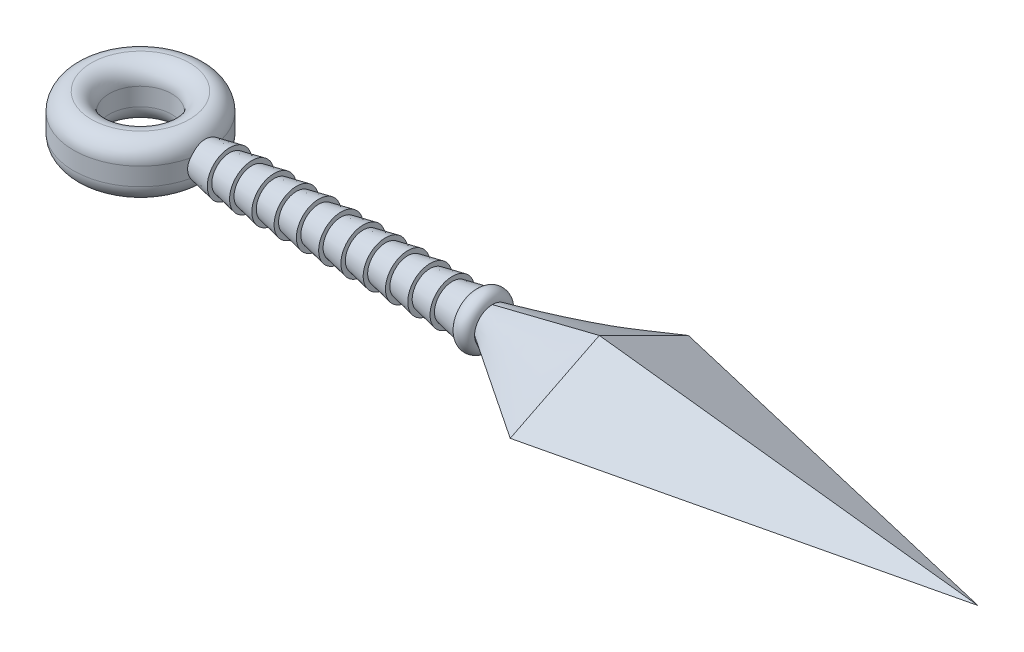
ISO-10303-21;
HEADER;
FILE_DESCRIPTION(('STEP AP214'),'2;1');
FILE_NAME('part.step','',(''),(''),'','','');
FILE_SCHEMA(('AUTOMOTIVE_DESIGN { 1 0 10303 214 1 1 1 1 }'));
ENDSEC;
DATA;
#1=APPLICATION_CONTEXT('core data for automotive mechanical design processes');
#2=APPLICATION_PROTOCOL_DEFINITION('international standard','automotive_design',2000,#1);
#3=PRODUCT_CONTEXT('',#1,'mechanical');
#4=PRODUCT('Part','Part','',(#3));
#5=PRODUCT_RELATED_PRODUCT_CATEGORY('part','',(#4));
#6=PRODUCT_DEFINITION_FORMATION('','',#4);
#7=PRODUCT_DEFINITION_CONTEXT('part definition',#1,'design');
#8=PRODUCT_DEFINITION('design','',#6,#7);
#9=PRODUCT_DEFINITION_SHAPE('','',#8);
#10=(LENGTH_UNIT() NAMED_UNIT(*) SI_UNIT(.MILLI.,.METRE.));
#11=(NAMED_UNIT(*) PLANE_ANGLE_UNIT() SI_UNIT($,.RADIAN.));
#12=(NAMED_UNIT(*) SI_UNIT($,.STERADIAN.) SOLID_ANGLE_UNIT());
#13=UNCERTAINTY_MEASURE_WITH_UNIT(LENGTH_MEASURE(1.E-05),#10,'distance_accuracy_value','');
#14=(GEOMETRIC_REPRESENTATION_CONTEXT(3) GLOBAL_UNCERTAINTY_ASSIGNED_CONTEXT((#13)) GLOBAL_UNIT_ASSIGNED_CONTEXT((#10,
#11,#12)) REPRESENTATION_CONTEXT('',''));
#15=CARTESIAN_POINT('',(0.,0.,0.));
#16=DIRECTION('',(0.,0.,1.));
#17=DIRECTION('',(1.,0.,0.));
#18=AXIS2_PLACEMENT_3D('',#15,#16,#17);
#19=CARTESIAN_POINT('',(79.,0.,0.));
#20=DIRECTION('',(1.,0.,0.));
#21=DIRECTION('',(0.,0.,-1.));
#22=AXIS2_PLACEMENT_3D('',#19,#20,#21);
#23=PLANE('',#22);
#24=CARTESIAN_POINT('',(79.,0.,0.));
#25=DIRECTION('',(1.,0.,0.));
#26=DIRECTION('',(0.,0.,-1.));
#27=AXIS2_PLACEMENT_3D('',#24,#25,#26);
#28=CIRCLE('',#27,4.);
#29=CARTESIAN_POINT('',(79.,0.,4.));
#30=VERTEX_POINT('',#29);
#31=CARTESIAN_POINT('',(79.,-4.,0.));
#32=VERTEX_POINT('',#31);
#33=EDGE_CURVE('E14',#30,#32,#28,.T.);
#34=ORIENTED_EDGE('',*,*,#33,.F.);
#35=CARTESIAN_POINT('',(79.,4.,0.));
#36=VERTEX_POINT('',#35);
#37=EDGE_CURVE('E206',#36,#30,#28,.T.);
#38=ORIENTED_EDGE('',*,*,#37,.F.);
#39=CARTESIAN_POINT('',(79.,0.,-4.));
#40=VERTEX_POINT('',#39);
#41=EDGE_CURVE('E267',#40,#36,#28,.T.);
#42=ORIENTED_EDGE('',*,*,#41,.F.);
#43=EDGE_CURVE('E101',#32,#40,#28,.T.);
#44=ORIENTED_EDGE('',*,*,#43,.F.);
#45=EDGE_LOOP('',(#34,#38,#42,#44));
#46=FACE_BOUND('',#45,.T.);
#47=ADVANCED_FACE('F91',(#46),#23,.F.);
#48=CARTESIAN_POINT('',(103.,10.,0.));
#49=CARTESIAN_POINT('',(79.,4.,0.));
#50=CARTESIAN_POINT('',(103.,9.16666666666666,-1.66666666666667));
#51=CARTESIAN_POINT('',(79.,4.,-0.471404520791031));
#52=CARTESIAN_POINT('',(103.,8.33333333333333,-3.33333333333334));
#53=CARTESIAN_POINT('',(79.,3.91408504474602,-0.979991036711966));
#54=CARTESIAN_POINT('',(103.,6.66666666666666,-6.66666666666668));
#55=CARTESIAN_POINT('',(79.,3.52422136375342,-1.96476663978302));
#56=CARTESIAN_POINT('',(103.,5.83333333333333,-8.33333333333335));
#57=CARTESIAN_POINT('',(79.,3.21895141649746,-2.43790283299492));
#58=CARTESIAN_POINT('',(103.,4.16666666666666,-11.6666666666667));
#59=CARTESIAN_POINT('',(79.,2.43790283299492,-3.21895141649746));
#60=CARTESIAN_POINT('',(103.,3.33333333333332,-13.3333333333333));
#61=CARTESIAN_POINT('',(79.,1.96476663978302,-3.52422136375342));
#62=CARTESIAN_POINT('',(103.,1.66666666666666,-16.6666666666667));
#63=CARTESIAN_POINT('',(79.,0.979991036711966,-3.91408504474602));
#64=CARTESIAN_POINT('',(103.,0.83333333333333,-18.3333333333333));
#65=CARTESIAN_POINT('',(79.,0.471404520791032,-4.));
#66=CARTESIAN_POINT('',(103.,0.,-20.));
#67=CARTESIAN_POINT('',(79.,0.,-4.));
#68=B_SPLINE_SURFACE_WITH_KNOTS('',3,1,((#48,#49),(#50,#51),(#52,#53),(#54,#55),(#56,#57),(#58,
#59),(#60,#61),(#62,#63),(#64,#65),(#66,#67)),.UNSPECIFIED.,.F.,.F.,.F.,(4,2,2,2,4),(2,2),(0.,
0.25,0.5,0.75,1.),(0.,1.),.UNSPECIFIED.);
#69=DIRECTION('',(0.,0.447213595499958,0.894427190999916));
#70=VECTOR('',#69,1.);
#71=CARTESIAN_POINT('',(103.,10.,0.));
#72=LINE('',#71,#70);
#73=CARTESIAN_POINT('',(103.,0.,-20.));
#74=VERTEX_POINT('',#73);
#75=CARTESIAN_POINT('',(103.,10.,0.));
#76=VERTEX_POINT('',#75);
#77=EDGE_CURVE('E174',#74,#76,#72,.T.);
#78=DIRECTION('',(-0.832050294337844,0.,0.554700196225229));
#79=VECTOR('',#78,1.);
#80=CARTESIAN_POINT('',(91.,0.,-12.));
#81=LINE('',#80,#79);
#82=EDGE_CURVE('E144',#74,#40,#81,.T.);
#83=DIRECTION('',(0.970142500145332,0.242535625036333,0.));
#84=VECTOR('',#83,1.);
#85=CARTESIAN_POINT('',(91.,7.,0.));
#86=LINE('',#85,#84);
#87=EDGE_CURVE('E184',#36,#76,#86,.T.);
#88=ORIENTED_EDGE('',*,*,#77,.F.);
#89=ORIENTED_EDGE('',*,*,#82,.T.);
#90=ORIENTED_EDGE('',*,*,#41,.T.);
#91=ORIENTED_EDGE('',*,*,#87,.T.);
#92=EDGE_LOOP('',(#88,#89,#90,#91));
#93=FACE_BOUND('',#92,.T.);
#94=ADVANCED_FACE('F313',(#93),#68,.T.);
#95=CARTESIAN_POINT('',(103.,0.,-20.));
#96=CARTESIAN_POINT('',(79.,0.,-4.));
#97=CARTESIAN_POINT('',(103.,-0.833333333333335,-18.3333333333333));
#98=CARTESIAN_POINT('',(79.,-0.471404520791032,-4.));
#99=CARTESIAN_POINT('',(103.,-1.66666666666667,-16.6666666666667));
#100=CARTESIAN_POINT('',(79.,-0.979991036711967,-3.91408504474602));
#101=CARTESIAN_POINT('',(103.,-3.33333333333334,-13.3333333333333));
#102=CARTESIAN_POINT('',(79.,-1.96476663978302,-3.52422136375342));
#103=CARTESIAN_POINT('',(103.,-4.16666666666667,-11.6666666666667));
#104=CARTESIAN_POINT('',(79.,-2.43790283299492,-3.21895141649746));
#105=CARTESIAN_POINT('',(103.,-5.83333333333334,-8.33333333333333));
#106=CARTESIAN_POINT('',(79.,-3.21895141649746,-2.43790283299492));
#107=CARTESIAN_POINT('',(103.,-6.66666666666667,-6.66666666666666));
#108=CARTESIAN_POINT('',(79.,-3.52422136375342,-1.96476663978302));
#109=CARTESIAN_POINT('',(103.,-8.33333333333334,-3.33333333333333));
#110=CARTESIAN_POINT('',(79.,-3.91408504474602,-0.979991036711966));
#111=CARTESIAN_POINT('',(103.,-9.16666666666667,-1.66666666666667));
#112=CARTESIAN_POINT('',(79.,-4.,-0.471404520791031));
#113=CARTESIAN_POINT('',(103.,-10.,0.));
#114=CARTESIAN_POINT('',(79.,-4.,0.));
#115=B_SPLINE_SURFACE_WITH_KNOTS('',3,1,((#95,#96),(#97,#98),(#99,#100),(#101,#102),(#103,#104),
(#105,#106),(#107,#108),(#109,#110),(#111,#112),(#113,#114)),.UNSPECIFIED.,.F.,.F.,.F.,(4,2,2,2,
4),(2,2),(0.,0.25,0.5,0.75,1.),(0.,1.),.UNSPECIFIED.);
#116=DIRECTION('',(0.,0.447213595499958,-0.894427190999916));
#117=VECTOR('',#116,1.);
#118=CARTESIAN_POINT('',(103.,0.,-20.));
#119=LINE('',#118,#117);
#120=CARTESIAN_POINT('',(103.,-10.,0.));
#121=VERTEX_POINT('',#120);
#122=EDGE_CURVE('E147',#121,#74,#119,.T.);
#123=DIRECTION('',(-0.970142500145332,0.242535625036333,0.));
#124=VECTOR('',#123,1.);
#125=CARTESIAN_POINT('',(91.,-7.,0.));
#126=LINE('',#125,#124);
#127=EDGE_CURVE('E109',#121,#32,#126,.T.);
#128=ORIENTED_EDGE('',*,*,#122,.F.);
#129=ORIENTED_EDGE('',*,*,#127,.T.);
#130=ORIENTED_EDGE('',*,*,#43,.T.);
#131=ORIENTED_EDGE('',*,*,#82,.F.);
#132=EDGE_LOOP('',(#128,#129,#130,#131));
#133=FACE_BOUND('',#132,.T.);
#134=ADVANCED_FACE('F149',(#133),#115,.T.);
#135=CARTESIAN_POINT('',(103.,0.,20.));
#136=CARTESIAN_POINT('',(79.,0.,4.));
#137=CARTESIAN_POINT('',(103.,0.833333333333335,18.3333333333333));
#138=CARTESIAN_POINT('',(79.,0.471404520791032,4.));
#139=CARTESIAN_POINT('',(103.,1.66666666666667,16.6666666666667));
#140=CARTESIAN_POINT('',(79.,0.979991036711967,3.91408504474602));
#141=CARTESIAN_POINT('',(103.,3.33333333333334,13.3333333333333));
#142=CARTESIAN_POINT('',(79.,1.96476663978302,3.52422136375342));
#143=CARTESIAN_POINT('',(103.,4.16666666666667,11.6666666666667));
#144=CARTESIAN_POINT('',(79.,2.43790283299492,3.21895141649746));
#145=CARTESIAN_POINT('',(103.,5.83333333333334,8.33333333333332));
#146=CARTESIAN_POINT('',(79.,3.21895141649746,2.43790283299492));
#147=CARTESIAN_POINT('',(103.,6.66666666666667,6.66666666666666));
#148=CARTESIAN_POINT('',(79.,3.52422136375342,1.96476663978302));
#149=CARTESIAN_POINT('',(103.,8.33333333333334,3.33333333333333));
#150=CARTESIAN_POINT('',(79.,3.91408504474602,0.979991036711967));
#151=CARTESIAN_POINT('',(103.,9.16666666666667,1.66666666666666));
#152=CARTESIAN_POINT('',(79.,4.,0.471404520791032));
#153=CARTESIAN_POINT('',(103.,10.,0.));
#154=CARTESIAN_POINT('',(79.,4.,0.));
#155=B_SPLINE_SURFACE_WITH_KNOTS('',3,1,((#135,#136),(#137,#138),(#139,#140),(#141,#142),(#143,
#144),(#145,#146),(#147,#148),(#149,#150),(#151,#152),(#153,#154)),.UNSPECIFIED.,.F.,.F.,.F.,(4,
2,2,2,4),(2,2),(0.,0.25,0.5,0.75,1.),(0.,1.),.UNSPECIFIED.);
#156=DIRECTION('',(0.,-0.447213595499958,0.894427190999916));
#157=VECTOR('',#156,1.);
#158=CARTESIAN_POINT('',(103.,0.,20.));
#159=LINE('',#158,#157);
#160=CARTESIAN_POINT('',(103.,0.,20.));
#161=VERTEX_POINT('',#160);
#162=EDGE_CURVE('E170',#76,#161,#159,.T.);
#163=DIRECTION('',(-0.832050294337844,0.,-0.554700196225229));
#164=VECTOR('',#163,1.);
#165=CARTESIAN_POINT('',(91.,0.,12.));
#166=LINE('',#165,#164);
#167=EDGE_CURVE('E143',#161,#30,#166,.T.);
#168=ORIENTED_EDGE('',*,*,#162,.F.);
#169=ORIENTED_EDGE('',*,*,#87,.F.);
#170=ORIENTED_EDGE('',*,*,#37,.T.);
#171=ORIENTED_EDGE('',*,*,#167,.F.);
#172=EDGE_LOOP('',(#168,#169,#170,#171));
#173=FACE_BOUND('',#172,.T.);
#174=ADVANCED_FACE('F223',(#173),#155,.T.);
#175=CARTESIAN_POINT('',(103.,-10.,0.));
#176=CARTESIAN_POINT('',(79.,-4.,0.));
#177=CARTESIAN_POINT('',(103.,-9.16666666666666,1.66666666666667));
#178=CARTESIAN_POINT('',(79.,-4.,0.471404520791033));
#179=CARTESIAN_POINT('',(103.,-8.33333333333333,3.33333333333334));
#180=CARTESIAN_POINT('',(79.,-3.91408504474602,0.979991036711967));
#181=CARTESIAN_POINT('',(103.,-6.66666666666666,6.66666666666668));
#182=CARTESIAN_POINT('',(79.,-3.52422136375342,1.96476663978302));
#183=CARTESIAN_POINT('',(103.,-5.83333333333332,8.33333333333335));
#184=CARTESIAN_POINT('',(79.,-3.21895141649746,2.43790283299492));
#185=CARTESIAN_POINT('',(103.,-4.16666666666666,11.6666666666667));
#186=CARTESIAN_POINT('',(79.,-2.43790283299492,3.21895141649746));
#187=CARTESIAN_POINT('',(103.,-3.33333333333332,13.3333333333333));
#188=CARTESIAN_POINT('',(79.,-1.96476663978302,3.52422136375342));
#189=CARTESIAN_POINT('',(103.,-1.66666666666666,16.6666666666667));
#190=CARTESIAN_POINT('',(79.,-0.979991036711966,3.91408504474602));
#191=CARTESIAN_POINT('',(103.,-0.83333333333333,18.3333333333333));
#192=CARTESIAN_POINT('',(79.,-0.471404520791031,4.));
#193=CARTESIAN_POINT('',(103.,0.,20.));
#194=CARTESIAN_POINT('',(79.,0.,4.));
#195=B_SPLINE_SURFACE_WITH_KNOTS('',3,1,((#175,#176),(#177,#178),(#179,#180),(#181,#182),(#183,
#184),(#185,#186),(#187,#188),(#189,#190),(#191,#192),(#193,#194)),.UNSPECIFIED.,.F.,.F.,.F.,(4,
2,2,2,4),(2,2),(0.,0.25,0.5,0.75,1.),(0.,1.),.UNSPECIFIED.);
#196=DIRECTION('',(0.,-0.447213595499958,-0.894427190999916));
#197=VECTOR('',#196,1.);
#198=CARTESIAN_POINT('',(103.,-10.,0.));
#199=LINE('',#198,#197);
#200=EDGE_CURVE('E139',#161,#121,#199,.T.);
#201=ORIENTED_EDGE('',*,*,#200,.F.);
#202=ORIENTED_EDGE('',*,*,#167,.T.);
#203=ORIENTED_EDGE('',*,*,#33,.T.);
#204=ORIENTED_EDGE('',*,*,#127,.F.);
#205=EDGE_LOOP('',(#201,#202,#203,#204));
#206=FACE_BOUND('',#205,.T.);
#207=ADVANCED_FACE('F136',(#206),#195,.T.);
#208=CARTESIAN_POINT('',(2.05886379192334,-17.5003422313484,-8.7501711156742));
#209=DIRECTION('',(-0.104648951970521,0.889516091749428,0.444758045874714));
#210=DIRECTION('',(0.,-0.447213595499958,0.894427190999916));
#211=AXIS2_PLACEMENT_3D('',#208,#209,#210);
#212=PLANE('',#211);
#213=DIRECTION('',(0.973417168333576,0.,0.229039333725547));
#214=VECTOR('',#213,1.);
#215=CARTESIAN_POINT('',(103.,0.,-20.));
#216=LINE('',#215,#214);
#217=CARTESIAN_POINT('',(188.,0.,0.));
#218=VERTEX_POINT('',#217);
#219=EDGE_CURVE('E160',#74,#218,#216,.T.);
#220=ORIENTED_EDGE('',*,*,#219,.T.);
#221=DIRECTION('',(0.993150604322876,0.116841247567397,0.));
#222=VECTOR('',#221,1.);
#223=CARTESIAN_POINT('',(103.,-10.,0.));
#224=LINE('',#223,#222);
#225=EDGE_CURVE('E158',#121,#218,#224,.T.);
#226=ORIENTED_EDGE('',*,*,#225,.F.);
#227=ORIENTED_EDGE('',*,*,#122,.T.);
#228=EDGE_LOOP('',(#220,#226,#227));
#229=FACE_BOUND('',#228,.T.);
#230=ADVANCED_FACE('F159',(#229),#212,.F.);
#231=CARTESIAN_POINT('',(2.05886379192334,-17.5003422313484,8.7501711156742));
#232=DIRECTION('',(-0.104648951970521,0.889516091749428,-0.444758045874714));
#233=DIRECTION('',(0.,0.447213595499958,0.894427190999916));
#234=AXIS2_PLACEMENT_3D('',#231,#232,#233);
#235=PLANE('',#234);
#236=ORIENTED_EDGE('',*,*,#225,.T.);
#237=DIRECTION('',(0.973417168333576,0.,-0.229039333725547));
#238=VECTOR('',#237,1.);
#239=CARTESIAN_POINT('',(103.,0.,20.));
#240=LINE('',#239,#238);
#241=EDGE_CURVE('E156',#161,#218,#240,.T.);
#242=ORIENTED_EDGE('',*,*,#241,.F.);
#243=ORIENTED_EDGE('',*,*,#200,.T.);
#244=EDGE_LOOP('',(#236,#242,#243));
#245=FACE_BOUND('',#244,.T.);
#246=ADVANCED_FACE('F167',(#245),#235,.F.);
#247=CARTESIAN_POINT('',(2.05886379192334,17.5003422313484,-8.7501711156742));
#248=DIRECTION('',(-0.104648951970521,-0.889516091749428,0.444758045874714));
#249=DIRECTION('',(0.,-0.447213595499958,-0.894427190999916));
#250=AXIS2_PLACEMENT_3D('',#247,#248,#249);
#251=PLANE('',#250);
#252=DIRECTION('',(0.993150604322876,-0.116841247567397,0.));
#253=VECTOR('',#252,1.);
#254=CARTESIAN_POINT('',(103.,10.,0.));
#255=LINE('',#254,#253);
#256=EDGE_CURVE('E165',#76,#218,#255,.T.);
#257=ORIENTED_EDGE('',*,*,#256,.T.);
#258=ORIENTED_EDGE('',*,*,#219,.F.);
#259=ORIENTED_EDGE('',*,*,#77,.T.);
#260=EDGE_LOOP('',(#257,#258,#259));
#261=FACE_BOUND('',#260,.T.);
#262=ADVANCED_FACE('F303',(#261),#251,.F.);
#263=CARTESIAN_POINT('',(2.05886379192334,17.5003422313484,8.7501711156742));
#264=DIRECTION('',(-0.104648951970521,-0.889516091749428,-0.444758045874714));
#265=DIRECTION('',(0.,0.447213595499958,-0.894427190999916));
#266=AXIS2_PLACEMENT_3D('',#263,#264,#265);
#267=PLANE('',#266);
#268=ORIENTED_EDGE('',*,*,#241,.T.);
#269=ORIENTED_EDGE('',*,*,#256,.F.);
#270=ORIENTED_EDGE('',*,*,#162,.T.);
#271=EDGE_LOOP('',(#268,#269,#270));
#272=FACE_BOUND('',#271,.T.);
#273=ADVANCED_FACE('F291',(#272),#267,.F.);
#274=CLOSED_SHELL('',(#47,#94,#134,#174,#207,#230,#246,#262,#273));
#275=MANIFOLD_SOLID_BREP('B2',#274);
#276=CARTESIAN_POINT('',(77.,0.,0.));
#277=DIRECTION('',(1.,0.,0.));
#278=DIRECTION('',(0.,0.,-1.));
#279=AXIS2_PLACEMENT_3D('',#276,#277,#278);
#280=TOROIDAL_SURFACE('',#279,4.,2.);
#281=CARTESIAN_POINT('',(75.30457721402,0.,0.));
#282=DIRECTION('',(1.,0.,0.));
#283=DIRECTION('',(0.,0.,-1.));
#284=AXIS2_PLACEMENT_3D('',#281,#282,#283);
#285=CIRCLE('',#284,5.06091544280401);
#286=CARTESIAN_POINT('',(75.30457721402,0.,-5.06091544280401));
#287=VERTEX_POINT('',#286);
#288=EDGE_CURVE('E89',#287,#287,#285,.F.);
#289=ORIENTED_EDGE('',*,*,#288,.F.);
#290=EDGE_LOOP('',(#289));
#291=FACE_BOUND('',#290,.T.);
#292=CARTESIAN_POINT('',(79.,0.,0.));
#293=DIRECTION('',(1.,0.,0.));
#294=DIRECTION('',(0.,0.,-1.));
#295=AXIS2_PLACEMENT_3D('',#292,#293,#294);
#296=CIRCLE('',#295,4.);
#297=CARTESIAN_POINT('',(79.,0.,-4.));
#298=VERTEX_POINT('',#297);
#299=EDGE_CURVE('E441',#298,#298,#296,.T.);
#300=ORIENTED_EDGE('',*,*,#299,.F.);
#301=EDGE_LOOP('',(#300));
#302=FACE_BOUND('',#301,.T.);
#303=ADVANCED_FACE('F434',(#291,#302),#280,.T.);
#304=CARTESIAN_POINT('',(79.,4.,0.));
#305=DIRECTION('',(1.,0.,0.));
#306=DIRECTION('',(0.,0.,-1.));
#307=AXIS2_PLACEMENT_3D('',#304,#305,#306);
#308=PLANE('',#307);
#309=ORIENTED_EDGE('',*,*,#299,.T.);
#310=EDGE_LOOP('',(#309));
#311=FACE_BOUND('',#310,.T.);
#312=ADVANCED_FACE('F523',(#311),#308,.T.);
#313=CARTESIAN_POINT('',(0.,6.,0.));
#314=DIRECTION('',(0.,-1.,0.));
#315=DIRECTION('',(0.,0.,-1.));
#316=AXIS2_PLACEMENT_3D('',#313,#314,#315);
#317=CYLINDRICAL_SURFACE('',#316,15.);
#318=CARTESIAN_POINT('',(0.,2.,0.));
#319=DIRECTION('',(0.,1.,0.));
#320=DIRECTION('',(0.,0.,1.));
#321=AXIS2_PLACEMENT_3D('',#318,#319,#320);
#322=CIRCLE('',#321,15.);
#323=CARTESIAN_POINT('',(14.6153846153826,1.9999999999846,3.37498630285178));
#324=VERTEX_POINT('',#323);
#325=CARTESIAN_POINT('',(14.6153846153846,2.,-3.37498630284312));
#326=VERTEX_POINT('',#325);
#327=EDGE_CURVE('E461',#324,#326,#322,.F.);
#328=ORIENTED_EDGE('',*,*,#327,.T.);
#329=CARTESIAN_POINT('',(14.6154105906865,2.0002,-3.37487381477421));
#330=CARTESIAN_POINT('',(14.6027138293659,1.90250293982287,-3.42983621464306));
#331=CARTESIAN_POINT('',(14.5906384426125,1.80244320904039,-3.48073791157674));
#332=CARTESIAN_POINT('',(14.5680468176114,1.59829661181208,-3.57412381080901));
#333=CARTESIAN_POINT('',(14.5575306336214,1.4942096053825,-3.61660772019965));
#334=CARTESIAN_POINT('',(14.5383921112485,1.28290533842762,-3.69278894745918));
#335=CARTESIAN_POINT('',(14.5297663728476,1.17569409715401,-3.726502060624));
#336=CARTESIAN_POINT('',(14.5146348843329,0.958750833728954,-3.78500615125284));
#337=CARTESIAN_POINT('',(14.5081290563441,0.849018904333701,-3.80979745646352));
#338=CARTESIAN_POINT('',(14.4920951274375,0.516888218113103,-3.87053992226915));
#339=CARTESIAN_POINT('',(14.4860596412639,0.291651453835964,-3.89282478642792));
#340=CARTESIAN_POINT('',(14.4841062228575,-0.15950269289474,-3.90008800709725));
#341=CARTESIAN_POINT('',(14.4881903452426,-0.385420204261451,-3.88505878760388));
#342=CARTESIAN_POINT('',(14.5019088755062,-0.730314550808398,-3.83339476912513));
#343=CARTESIAN_POINT('',(14.5082014991912,-0.851486899692062,-3.80959109126928));
#344=CARTESIAN_POINT('',(14.5234169578268,-1.09107835969005,-3.75117142205507));
#345=CARTESIAN_POINT('',(14.5323402029617,-1.20949703832431,-3.716553744454));
#346=CARTESIAN_POINT('',(14.5525321085692,-1.44283913411695,-3.63669061975166));
#347=CARTESIAN_POINT('',(14.5638070654039,-1.55775219895544,-3.59141659917936));
#348=CARTESIAN_POINT('',(14.5882739977803,-1.78279390775201,-3.49068547325756));
#349=CARTESIAN_POINT('',(14.6014657157137,-1.89292319205985,-3.43522973604411));
#350=CARTESIAN_POINT('',(14.6154105906865,-2.0002,-3.37487381477421));
#351=B_SPLINE_CURVE_WITH_KNOTS('',3,(#329,#330,#331,#332,#333,#334,#335,#336,#337,#338,#339,
#340,#341,#342,#343,#344,#345,#346,#347,#348,#349,#350),.UNSPECIFIED.,.F.,.F.,(4,2,2,2,2,2,2,2,
2,2,4),(0.,0.338336084528955,0.676683939838855,1.01441818044109,1.35214001295607,
2.02788978779988,2.70377677361315,3.07426138207037,3.44480378959322,3.81635130586237,
4.18784893309671),.UNSPECIFIED.);
#352=CARTESIAN_POINT('',(14.6153846153826,-2.,-3.37498630285178));
#353=VERTEX_POINT('',#352);
#354=EDGE_CURVE('E448',#326,#353,#351,.T.);
#355=ORIENTED_EDGE('',*,*,#354,.T.);
#356=CARTESIAN_POINT('',(0.,-2.,0.));
#357=DIRECTION('',(0.,1.,0.));
#358=DIRECTION('',(0.,0.,1.));
#359=AXIS2_PLACEMENT_3D('',#356,#357,#358);
#360=CIRCLE('',#359,15.);
#361=CARTESIAN_POINT('',(14.6153846153846,-2.,3.37498630284312));
#362=VERTEX_POINT('',#361);
#363=EDGE_CURVE('E467',#353,#362,#360,.T.);
#364=ORIENTED_EDGE('',*,*,#363,.T.);
#365=CARTESIAN_POINT('',(14.6154105906865,-2.0002,3.37487381477421));
#366=CARTESIAN_POINT('',(14.6027138293659,-1.90250293982287,3.42983621464306));
#367=CARTESIAN_POINT('',(14.5906384426125,-1.80244320904039,3.48073791157674));
#368=CARTESIAN_POINT('',(14.5680468176114,-1.59829661181208,3.57412381080901));
#369=CARTESIAN_POINT('',(14.5575306336214,-1.4942096053825,3.61660772019965));
#370=CARTESIAN_POINT('',(14.5383921112485,-1.28290533842762,3.69278894745918));
#371=CARTESIAN_POINT('',(14.5297663728476,-1.17569409715401,3.726502060624));
#372=CARTESIAN_POINT('',(14.5146348843329,-0.958750833728954,3.78500615125284));
#373=CARTESIAN_POINT('',(14.5081290563441,-0.849018904333701,3.80979745646352));
#374=CARTESIAN_POINT('',(14.4920951274375,-0.516888218113103,3.87053992226915));
#375=CARTESIAN_POINT('',(14.4860596412639,-0.291651453835964,3.89282478642792));
#376=CARTESIAN_POINT('',(14.4841062228575,0.15950269289474,3.90008800709725));
#377=CARTESIAN_POINT('',(14.4881903452426,0.385420204261451,3.88505878760388));
#378=CARTESIAN_POINT('',(14.5019088755062,0.730314550808398,3.83339476912513));
#379=CARTESIAN_POINT('',(14.5082014991912,0.851486899692062,3.80959109126928));
#380=CARTESIAN_POINT('',(14.5234169578268,1.09107835969005,3.75117142205507));
#381=CARTESIAN_POINT('',(14.5323402029617,1.20949703832431,3.716553744454));
#382=CARTESIAN_POINT('',(14.5525321085692,1.44283913411695,3.63669061975166));
#383=CARTESIAN_POINT('',(14.5638070654039,1.55775219895544,3.59141659917936));
#384=CARTESIAN_POINT('',(14.5882739977803,1.78279390775201,3.49068547325756));
#385=CARTESIAN_POINT('',(14.6014657157137,1.89292319205985,3.43522973604411));
#386=CARTESIAN_POINT('',(14.6154105906865,2.0002,3.37487381477421));
#387=B_SPLINE_CURVE_WITH_KNOTS('',3,(#365,#366,#367,#368,#369,#370,#371,#372,#373,#374,#375,
#376,#377,#378,#379,#380,#381,#382,#383,#384,#385,#386),.UNSPECIFIED.,.F.,.F.,(4,2,2,2,2,2,2,2,
2,2,4),(0.,0.338336084528955,0.676683939838855,1.01441818044109,1.35214001295607,
2.02788978779988,2.70377677361315,3.07426138207037,3.44480378959322,3.81635130586237,
4.18784893309671),.UNSPECIFIED.);
#388=EDGE_CURVE('E471',#362,#324,#387,.T.);
#389=ORIENTED_EDGE('',*,*,#388,.T.);
#390=EDGE_LOOP('',(#328,#355,#364,#389));
#391=FACE_BOUND('',#390,.T.);
#392=ADVANCED_FACE('F472',(#391),#317,.T.);
#393=CARTESIAN_POINT('',(0.,6.,0.));
#394=DIRECTION('',(0.,-1.,0.));
#395=DIRECTION('',(0.,0.,-1.));
#396=AXIS2_PLACEMENT_3D('',#393,#394,#395);
#397=CYLINDRICAL_SURFACE('',#396,7.);
#398=CARTESIAN_POINT('',(0.,-2.,0.));
#399=DIRECTION('',(0.,1.,0.));
#400=DIRECTION('',(0.,0.,1.));
#401=AXIS2_PLACEMENT_3D('',#398,#399,#400);
#402=CIRCLE('',#401,7.);
#403=CARTESIAN_POINT('',(0.,-2.,7.));
#404=VERTEX_POINT('',#403);
#405=EDGE_CURVE('E468',#404,#404,#402,.F.);
#406=ORIENTED_EDGE('',*,*,#405,.T.);
#407=EDGE_LOOP('',(#406));
#408=FACE_BOUND('',#407,.T.);
#409=CARTESIAN_POINT('',(0.,2.,0.));
#410=DIRECTION('',(0.,1.,0.));
#411=DIRECTION('',(0.,0.,1.));
#412=AXIS2_PLACEMENT_3D('',#409,#410,#411);
#413=CIRCLE('',#412,7.);
#414=CARTESIAN_POINT('',(0.,2.,7.));
#415=VERTEX_POINT('',#414);
#416=EDGE_CURVE('E972',#415,#415,#413,.T.);
#417=ORIENTED_EDGE('',*,*,#416,.T.);
#418=EDGE_LOOP('',(#417));
#419=FACE_BOUND('',#418,.T.);
#420=ADVANCED_FACE('F522',(#408,#419),#397,.F.);
#421=CARTESIAN_POINT('',(0.,-2.,0.));
#422=DIRECTION('',(0.,1.,0.));
#423=DIRECTION('',(0.,0.,1.));
#424=AXIS2_PLACEMENT_3D('',#421,#422,#423);
#425=TOROIDAL_SURFACE('',#424,11.,4.);
#426=CARTESIAN_POINT('',(14.6153586377644,-1.9998,3.37509877478049));
#427=CARTESIAN_POINT('',(14.6262567360365,-2.0836337304674,3.32797909382551));
#428=CARTESIAN_POINT('',(14.6350148128079,-2.16568995320348,3.27726845787985));
#429=CARTESIAN_POINT('',(14.6487220305224,-2.32555955247767,3.16921563459832));
#430=CARTESIAN_POINT('',(14.6536741791833,-2.403376234123,3.11187872513069));
#431=CARTESIAN_POINT('',(14.6602381984213,-2.55379685866367,2.99138133721757));
#432=CARTESIAN_POINT('',(14.6618683722514,-2.62642722572163,2.92825478302505));
#433=CARTESIAN_POINT('',(14.6623681469487,-2.76647432048341,2.79646669749724));
#434=CARTESIAN_POINT('',(14.6612372671318,-2.83389013825515,2.72780420439799));
#435=CARTESIAN_POINT('',(14.6545240988218,-3.02734679050724,2.51472540857234));
#436=CARTESIAN_POINT('',(14.6456369848231,-3.14513789831142,2.36278135265477));
#437=CARTESIAN_POINT('',(14.6234288387789,-3.35647572875526,2.04305588725025));
#438=CARTESIAN_POINT('',(14.6101010820424,-3.44998529613921,1.87525073626065));
#439=CARTESIAN_POINT('',(14.5819221790538,-3.61955430573411,1.51038952577997));
#440=CARTESIAN_POINT('',(14.5670519839432,-3.69293324333158,1.31208647422979));
#441=CARTESIAN_POINT('',(14.5419690056409,-3.80774957508764,0.906106072536172));
#442=CARTESIAN_POINT('',(14.5317559504107,-3.8491888350429,0.698429270722565));
#443=CARTESIAN_POINT('',(14.5220782367434,-3.88773937505607,0.377557371015148));
#444=CARTESIAN_POINT('',(14.5198191286633,-3.89652510816428,0.26572475006876));
#445=CARTESIAN_POINT('',(14.5176613524982,-3.9049176240099,0.0416619573721824));
#446=CARTESIAN_POINT('',(14.5177627880865,-3.90452400359727,-0.0705682316224468));
#447=CARTESIAN_POINT('',(14.5203274646012,-3.89454975525728,-0.294600398981687));
#448=CARTESIAN_POINT('',(14.5227910202428,-3.88496790314259,-0.406402318293247));
#449=CARTESIAN_POINT('',(14.5298567461168,-3.85665864321697,-0.628774149396373));
#450=CARTESIAN_POINT('',(14.5344589011403,-3.83793130044467,-0.739344069943643));
#451=CARTESIAN_POINT('',(14.5453767707708,-3.79145985599286,-0.958222684874057));
#452=CARTESIAN_POINT('',(14.5516885780872,-3.76373628629853,-1.06653593619048));
#453=CARTESIAN_POINT('',(14.5654628880738,-3.69935674299754,-1.28044169275622));
#454=CARTESIAN_POINT('',(14.5729257909507,-3.66269766015874,-1.38603323677844));
#455=CARTESIAN_POINT('',(14.5883126959982,-3.58056611016152,-1.59377111104356));
#456=CARTESIAN_POINT('',(14.5962369651476,-3.53508850379965,-1.69591539136079));
#457=CARTESIAN_POINT('',(14.6117609592446,-3.43551302626657,-1.89593627020511));
#458=CARTESIAN_POINT('',(14.6193607034884,-3.38141566852834,-1.99381312247831));
#459=CARTESIAN_POINT('',(14.6333882820124,-3.26491107056305,-2.18440097201239));
#460=CARTESIAN_POINT('',(14.6398177186311,-3.20251539787827,-2.27711890995161));
#461=CARTESIAN_POINT('',(14.6506487471567,-3.06970127952924,-2.45668803164504));
#462=CARTESIAN_POINT('',(14.6550513487365,-2.99928685028247,-2.54354211804951));
#463=CARTESIAN_POINT('',(14.6609535665504,-2.85101454912718,-2.71039957453878));
#464=CARTESIAN_POINT('',(14.6624600077213,-2.77317463163949,-2.790418625023));
#465=CARTESIAN_POINT('',(14.6617398119828,-2.61053355946227,-2.942939359746));
#466=CARTESIAN_POINT('',(14.6595157022552,-2.52573715430209,-3.0154460977152));
#467=CARTESIAN_POINT('',(14.6514782319684,-2.3683872207011,-3.13778593975344));
#468=CARTESIAN_POINT('',(14.6465166522737,-2.29700197686259,-3.18918303726446));
#469=CARTESIAN_POINT('',(14.6334118391688,-2.15083411546337,-3.28640692658162));
#470=CARTESIAN_POINT('',(14.6252691724623,-2.07605210512508,-3.33223470864377));
#471=CARTESIAN_POINT('',(14.6153586377644,-1.9998,-3.37509877478049));
#472=B_SPLINE_CURVE_WITH_KNOTS('',3,(#426,#427,#428,#429,#430,#431,#432,#433,#434,#435,#436,
#437,#438,#439,#440,#441,#442,#443,#444,#445,#446,#447,#448,#449,#450,#451,#452,#453,#454,#455,
#456,#457,#458,#459,#460,#461,#462,#463,#464,#465,#466,#467,#468,#469,#470,#471),.UNSPECIFIED.,
.F.,.F.,(4,2,2,2,2,2,2,2,2,2,2,2,2,2,2,2,2,2,2,2,2,2,4),(0.,0.290198609295044,0.580167646308811,
0.868534658759339,1.15695187788744,1.73172549943931,2.30737351621158,2.94059264670533,
3.57377478409862,3.91003490492842,4.24630979406798,4.58262949277232,4.91894679975624,
5.25450186949105,5.59017386723413,5.92604207691509,6.26189028817803,6.59727515272436,
6.93249276321654,7.26691944483659,7.60111966775055,7.86514117221986,8.12911566326387),.UNSPECIFIED.);
#473=EDGE_CURVE('E454',#362,#353,#472,.T.);
#474=ORIENTED_EDGE('',*,*,#473,.F.);
#475=ORIENTED_EDGE('',*,*,#363,.F.);
#476=EDGE_LOOP('',(#474,#475));
#477=FACE_BOUND('',#476,.T.);
#478=CARTESIAN_POINT('',(0.,-6.,0.));
#479=DIRECTION('',(0.,1.,0.));
#480=DIRECTION('',(0.,0.,1.));
#481=AXIS2_PLACEMENT_3D('',#478,#479,#480);
#482=CIRCLE('',#481,11.);
#483=CARTESIAN_POINT('',(0.,-6.,11.));
#484=VERTEX_POINT('',#483);
#485=EDGE_CURVE('E973',#484,#484,#482,.F.);
#486=ORIENTED_EDGE('',*,*,#485,.F.);
#487=EDGE_LOOP('',(#486));
#488=FACE_BOUND('',#487,.T.);
#489=ADVANCED_FACE('F528',(#477,#488),#425,.T.);
#490=CARTESIAN_POINT('',(0.,-2.,0.));
#491=DIRECTION('',(0.,1.,0.));
#492=DIRECTION('',(0.,0.,1.));
#493=AXIS2_PLACEMENT_3D('',#490,#491,#492);
#494=TOROIDAL_SURFACE('',#493,11.,4.);
#495=ORIENTED_EDGE('',*,*,#405,.F.);
#496=EDGE_LOOP('',(#495));
#497=FACE_BOUND('',#496,.T.);
#498=ORIENTED_EDGE('',*,*,#485,.T.);
#499=EDGE_LOOP('',(#498));
#500=FACE_BOUND('',#499,.T.);
#501=ADVANCED_FACE('F525',(#497,#500),#494,.T.);
#502=CARTESIAN_POINT('',(0.,2.,0.));
#503=DIRECTION('',(0.,1.,0.));
#504=DIRECTION('',(0.,0.,1.));
#505=AXIS2_PLACEMENT_3D('',#502,#503,#504);
#506=TOROIDAL_SURFACE('',#505,11.,4.);
#507=CARTESIAN_POINT('',(14.6153586377644,1.9998,-3.37509877478049));
#508=CARTESIAN_POINT('',(14.6262567360365,2.0836337304674,-3.32797909382551));
#509=CARTESIAN_POINT('',(14.6350148128079,2.16568995320348,-3.27726845787985));
#510=CARTESIAN_POINT('',(14.6487220305224,2.32555955247767,-3.16921563459832));
#511=CARTESIAN_POINT('',(14.6536741791833,2.403376234123,-3.11187872513069));
#512=CARTESIAN_POINT('',(14.6602381984213,2.55379685866367,-2.99138133721757));
#513=CARTESIAN_POINT('',(14.6618683722514,2.62642722572163,-2.92825478302505));
#514=CARTESIAN_POINT('',(14.6623681469487,2.76647432048341,-2.79646669749724));
#515=CARTESIAN_POINT('',(14.6612372671318,2.83389013825515,-2.72780420439799));
#516=CARTESIAN_POINT('',(14.6545240988218,3.02734679050724,-2.51472540857234));
#517=CARTESIAN_POINT('',(14.6456369848231,3.14513789831142,-2.36278135265477));
#518=CARTESIAN_POINT('',(14.6234288387789,3.35647572875526,-2.04305588725025));
#519=CARTESIAN_POINT('',(14.6101010820424,3.44998529613921,-1.87525073626065));
#520=CARTESIAN_POINT('',(14.5819221790538,3.61955430573411,-1.51038952577997));
#521=CARTESIAN_POINT('',(14.5670519839432,3.69293324333158,-1.31208647422979));
#522=CARTESIAN_POINT('',(14.5419690056409,3.80774957508764,-0.906106072536172));
#523=CARTESIAN_POINT('',(14.5317559504107,3.8491888350429,-0.698429270722565));
#524=CARTESIAN_POINT('',(14.5220782367434,3.88773937505607,-0.377557371015148));
#525=CARTESIAN_POINT('',(14.5198191286633,3.89652510816428,-0.26572475006876));
#526=CARTESIAN_POINT('',(14.5176613524982,3.9049176240099,-0.0416619573721824));
#527=CARTESIAN_POINT('',(14.5177627880865,3.90452400359727,0.0705682316224468));
#528=CARTESIAN_POINT('',(14.5203274646012,3.89454975525728,0.294600398981687));
#529=CARTESIAN_POINT('',(14.5227910202428,3.88496790314259,0.406402318293247));
#530=CARTESIAN_POINT('',(14.5298567461168,3.85665864321697,0.628774149396373));
#531=CARTESIAN_POINT('',(14.5344589011403,3.83793130044467,0.739344069943643));
#532=CARTESIAN_POINT('',(14.5453767707708,3.79145985599286,0.958222684874057));
#533=CARTESIAN_POINT('',(14.5516885780872,3.76373628629853,1.06653593619048));
#534=CARTESIAN_POINT('',(14.5654628880738,3.69935674299754,1.28044169275622));
#535=CARTESIAN_POINT('',(14.5729257909507,3.66269766015874,1.38603323677844));
#536=CARTESIAN_POINT('',(14.5883126959982,3.58056611016152,1.59377111104356));
#537=CARTESIAN_POINT('',(14.5962369651476,3.53508850379965,1.69591539136079));
#538=CARTESIAN_POINT('',(14.6117609592446,3.43551302626657,1.89593627020511));
#539=CARTESIAN_POINT('',(14.6193607034884,3.38141566852834,1.99381312247831));
#540=CARTESIAN_POINT('',(14.6333882820124,3.26491107056305,2.18440097201239));
#541=CARTESIAN_POINT('',(14.6398177186311,3.20251539787827,2.27711890995161));
#542=CARTESIAN_POINT('',(14.6506487471567,3.06970127952924,2.45668803164504));
#543=CARTESIAN_POINT('',(14.6550513487365,2.99928685028247,2.54354211804951));
#544=CARTESIAN_POINT('',(14.6609535665504,2.85101454912718,2.71039957453878));
#545=CARTESIAN_POINT('',(14.6624600077213,2.77317463163949,2.790418625023));
#546=CARTESIAN_POINT('',(14.6617398119828,2.61053355946227,2.942939359746));
#547=CARTESIAN_POINT('',(14.6595157022552,2.52573715430209,3.0154460977152));
#548=CARTESIAN_POINT('',(14.6514782319684,2.3683872207011,3.13778593975344));
#549=CARTESIAN_POINT('',(14.6465166522737,2.29700197686259,3.18918303726446));
#550=CARTESIAN_POINT('',(14.6334118391688,2.15083411546337,3.28640692658162));
#551=CARTESIAN_POINT('',(14.6252691724623,2.07605210512508,3.33223470864377));
#552=CARTESIAN_POINT('',(14.6153586377644,1.9998,3.37509877478049));
#553=B_SPLINE_CURVE_WITH_KNOTS('',3,(#507,#508,#509,#510,#511,#512,#513,#514,#515,#516,#517,
#518,#519,#520,#521,#522,#523,#524,#525,#526,#527,#528,#529,#530,#531,#532,#533,#534,#535,#536,
#537,#538,#539,#540,#541,#542,#543,#544,#545,#546,#547,#548,#549,#550,#551,#552),.UNSPECIFIED.,
.F.,.F.,(4,2,2,2,2,2,2,2,2,2,2,2,2,2,2,2,2,2,2,2,2,2,4),(0.,0.290198609295044,0.580167646308811,
0.868534658759339,1.15695187788744,1.73172549943931,2.30737351621158,2.94059264670533,
3.57377478409862,3.91003490492842,4.24630979406798,4.58262949277232,4.91894679975624,
5.25450186949105,5.59017386723413,5.92604207691509,6.26189028817803,6.59727515272436,
6.93249276321654,7.26691944483659,7.60111966775055,7.86514117221986,8.12911566326387),.UNSPECIFIED.);
#554=EDGE_CURVE('E466',#326,#324,#553,.T.);
#555=ORIENTED_EDGE('',*,*,#554,.F.);
#556=ORIENTED_EDGE('',*,*,#327,.F.);
#557=EDGE_LOOP('',(#555,#556));
#558=FACE_BOUND('',#557,.T.);
#559=CARTESIAN_POINT('',(0.,6.,0.));
#560=DIRECTION('',(0.,1.,0.));
#561=DIRECTION('',(0.,0.,1.));
#562=AXIS2_PLACEMENT_3D('',#559,#560,#561);
#563=CIRCLE('',#562,11.);
#564=CARTESIAN_POINT('',(0.,6.,11.));
#565=VERTEX_POINT('',#564);
#566=EDGE_CURVE('E488',#565,#565,#563,.T.);
#567=ORIENTED_EDGE('',*,*,#566,.F.);
#568=EDGE_LOOP('',(#567));
#569=FACE_BOUND('',#568,.T.);
#570=ADVANCED_FACE('F463',(#558,#569),#506,.T.);
#571=CARTESIAN_POINT('',(0.,2.,0.));
#572=DIRECTION('',(0.,1.,0.));
#573=DIRECTION('',(0.,0.,1.));
#574=AXIS2_PLACEMENT_3D('',#571,#572,#573);
#575=TOROIDAL_SURFACE('',#574,11.,4.);
#576=ORIENTED_EDGE('',*,*,#566,.T.);
#577=EDGE_LOOP('',(#576));
#578=FACE_BOUND('',#577,.T.);
#579=ORIENTED_EDGE('',*,*,#416,.F.);
#580=EDGE_LOOP('',(#579));
#581=FACE_BOUND('',#580,.T.);
#582=ADVANCED_FACE('F532',(#578,#581),#575,.T.);
#583=CARTESIAN_POINT('',(25.,0.,0.));
#584=DIRECTION('',(1.,0.,0.));
#585=DIRECTION('',(0.,0.,-1.));
#586=AXIS2_PLACEMENT_3D('',#583,#584,#585);
#587=PLANE('',#586);
#588=CARTESIAN_POINT('',(25.,0.,0.));
#589=DIRECTION('',(1.,0.,0.));
#590=DIRECTION('',(0.,0.,-1.));
#591=AXIS2_PLACEMENT_3D('',#588,#589,#590);
#592=CIRCLE('',#591,4.);
#593=CARTESIAN_POINT('',(25.,0.,-4.));
#594=VERTEX_POINT('',#593);
#595=EDGE_CURVE('E474',#594,#594,#592,.T.);
#596=ORIENTED_EDGE('',*,*,#595,.F.);
#597=EDGE_LOOP('',(#596));
#598=FACE_BOUND('',#597,.T.);
#599=CARTESIAN_POINT('',(25.,0.,0.));
#600=DIRECTION('',(1.,0.,0.));
#601=DIRECTION('',(0.,0.,-1.));
#602=AXIS2_PLACEMENT_3D('',#599,#600,#601);
#603=CIRCLE('',#602,5.);
#604=CARTESIAN_POINT('',(25.,0.,-5.));
#605=VERTEX_POINT('',#604);
#606=EDGE_CURVE('E614',#605,#605,#603,.T.);
#607=ORIENTED_EDGE('',*,*,#606,.T.);
#608=EDGE_LOOP('',(#607));
#609=FACE_BOUND('',#608,.T.);
#610=ADVANCED_FACE('F534',(#598,#609),#587,.T.);
#611=CARTESIAN_POINT('',(25.,0.,0.));
#612=DIRECTION('',(1.,0.,0.));
#613=DIRECTION('',(0.,0.,-1.));
#614=AXIS2_PLACEMENT_3D('',#611,#612,#613);
#615=CONICAL_SURFACE('',#614,5.,0.197395559849881);
#616=CARTESIAN_POINT('',(20.,0.,0.));
#617=DIRECTION('',(1.,0.,0.));
#618=DIRECTION('',(0.,0.,-1.));
#619=AXIS2_PLACEMENT_3D('',#616,#617,#618);
#620=CIRCLE('',#619,4.);
#621=CARTESIAN_POINT('',(20.,0.,-4.));
#622=VERTEX_POINT('',#621);
#623=EDGE_CURVE('E569',#622,#622,#620,.T.);
#624=ORIENTED_EDGE('',*,*,#623,.T.);
#625=EDGE_LOOP('',(#624));
#626=FACE_BOUND('',#625,.T.);
#627=ORIENTED_EDGE('',*,*,#606,.F.);
#628=EDGE_LOOP('',(#627));
#629=FACE_BOUND('',#628,.T.);
#630=ADVANCED_FACE('F540',(#626,#629),#615,.T.);
#631=CARTESIAN_POINT('',(30.,0.,0.));
#632=DIRECTION('',(1.,0.,0.));
#633=DIRECTION('',(0.,0.,-1.));
#634=AXIS2_PLACEMENT_3D('',#631,#632,#633);
#635=PLANE('',#634);
#636=CARTESIAN_POINT('',(30.,0.,0.));
#637=DIRECTION('',(1.,0.,0.));
#638=DIRECTION('',(0.,0.,-1.));
#639=AXIS2_PLACEMENT_3D('',#636,#637,#638);
#640=CIRCLE('',#639,4.);
#641=CARTESIAN_POINT('',(30.,0.,-4.));
#642=VERTEX_POINT('',#641);
#643=EDGE_CURVE('E611',#642,#642,#640,.T.);
#644=ORIENTED_EDGE('',*,*,#643,.F.);
#645=EDGE_LOOP('',(#644));
#646=FACE_BOUND('',#645,.T.);
#647=CARTESIAN_POINT('',(30.,0.,0.));
#648=DIRECTION('',(1.,0.,0.));
#649=DIRECTION('',(0.,0.,-1.));
#650=AXIS2_PLACEMENT_3D('',#647,#648,#649);
#651=CIRCLE('',#650,5.);
#652=CARTESIAN_POINT('',(30.,0.,-5.));
#653=VERTEX_POINT('',#652);
#654=EDGE_CURVE('E608',#653,#653,#651,.T.);
#655=ORIENTED_EDGE('',*,*,#654,.T.);
#656=EDGE_LOOP('',(#655));
#657=FACE_BOUND('',#656,.T.);
#658=ADVANCED_FACE('F627',(#646,#657),#635,.T.);
#659=CARTESIAN_POINT('',(30.,0.,0.));
#660=DIRECTION('',(1.,0.,0.));
#661=DIRECTION('',(0.,0.,-1.));
#662=AXIS2_PLACEMENT_3D('',#659,#660,#661);
#663=CONICAL_SURFACE('',#662,5.,0.197395559849881);
#664=ORIENTED_EDGE('',*,*,#595,.T.);
#665=EDGE_LOOP('',(#664));
#666=FACE_BOUND('',#665,.T.);
#667=ORIENTED_EDGE('',*,*,#654,.F.);
#668=EDGE_LOOP('',(#667));
#669=FACE_BOUND('',#668,.T.);
#670=ADVANCED_FACE('F633',(#666,#669),#663,.T.);
#671=CARTESIAN_POINT('',(35.,0.,0.));
#672=DIRECTION('',(1.,0.,0.));
#673=DIRECTION('',(0.,0.,-1.));
#674=AXIS2_PLACEMENT_3D('',#671,#672,#673);
#675=PLANE('',#674);
#676=CARTESIAN_POINT('',(35.,0.,0.));
#677=DIRECTION('',(1.,0.,0.));
#678=DIRECTION('',(0.,0.,-1.));
#679=AXIS2_PLACEMENT_3D('',#676,#677,#678);
#680=CIRCLE('',#679,4.);
#681=CARTESIAN_POINT('',(35.,0.,-4.));
#682=VERTEX_POINT('',#681);
#683=EDGE_CURVE('E605',#682,#682,#680,.T.);
#684=ORIENTED_EDGE('',*,*,#683,.F.);
#685=EDGE_LOOP('',(#684));
#686=FACE_BOUND('',#685,.T.);
#687=CARTESIAN_POINT('',(35.,0.,0.));
#688=DIRECTION('',(1.,0.,0.));
#689=DIRECTION('',(0.,0.,-1.));
#690=AXIS2_PLACEMENT_3D('',#687,#688,#689);
#691=CIRCLE('',#690,5.);
#692=CARTESIAN_POINT('',(35.,0.,-5.));
#693=VERTEX_POINT('',#692);
#694=EDGE_CURVE('E602',#693,#693,#691,.T.);
#695=ORIENTED_EDGE('',*,*,#694,.T.);
#696=EDGE_LOOP('',(#695));
#697=FACE_BOUND('',#696,.T.);
#698=ADVANCED_FACE('F639',(#686,#697),#675,.T.);
#699=CARTESIAN_POINT('',(35.,0.,0.));
#700=DIRECTION('',(1.,0.,0.));
#701=DIRECTION('',(0.,0.,-1.));
#702=AXIS2_PLACEMENT_3D('',#699,#700,#701);
#703=CONICAL_SURFACE('',#702,5.,0.197395559849881);
#704=ORIENTED_EDGE('',*,*,#643,.T.);
#705=EDGE_LOOP('',(#704));
#706=FACE_BOUND('',#705,.T.);
#707=ORIENTED_EDGE('',*,*,#694,.F.);
#708=EDGE_LOOP('',(#707));
#709=FACE_BOUND('',#708,.T.);
#710=ADVANCED_FACE('F643',(#706,#709),#703,.T.);
#711=CARTESIAN_POINT('',(40.,0.,0.));
#712=DIRECTION('',(1.,0.,0.));
#713=DIRECTION('',(0.,0.,-1.));
#714=AXIS2_PLACEMENT_3D('',#711,#712,#713);
#715=PLANE('',#714);
#716=CARTESIAN_POINT('',(40.,0.,0.));
#717=DIRECTION('',(1.,0.,0.));
#718=DIRECTION('',(0.,0.,-1.));
#719=AXIS2_PLACEMENT_3D('',#716,#717,#718);
#720=CIRCLE('',#719,4.);
#721=CARTESIAN_POINT('',(40.,0.,-4.));
#722=VERTEX_POINT('',#721);
#723=EDGE_CURVE('E599',#722,#722,#720,.T.);
#724=ORIENTED_EDGE('',*,*,#723,.F.);
#725=EDGE_LOOP('',(#724));
#726=FACE_BOUND('',#725,.T.);
#727=CARTESIAN_POINT('',(40.,0.,0.));
#728=DIRECTION('',(1.,0.,0.));
#729=DIRECTION('',(0.,0.,-1.));
#730=AXIS2_PLACEMENT_3D('',#727,#728,#729);
#731=CIRCLE('',#730,5.);
#732=CARTESIAN_POINT('',(40.,0.,-5.));
#733=VERTEX_POINT('',#732);
#734=EDGE_CURVE('E596',#733,#733,#731,.T.);
#735=ORIENTED_EDGE('',*,*,#734,.T.);
#736=EDGE_LOOP('',(#735));
#737=FACE_BOUND('',#736,.T.);
#738=ADVANCED_FACE('F647',(#726,#737),#715,.T.);
#739=CARTESIAN_POINT('',(40.,0.,0.));
#740=DIRECTION('',(1.,0.,0.));
#741=DIRECTION('',(0.,0.,-1.));
#742=AXIS2_PLACEMENT_3D('',#739,#740,#741);
#743=CONICAL_SURFACE('',#742,5.,0.197395559849881);
#744=ORIENTED_EDGE('',*,*,#683,.T.);
#745=EDGE_LOOP('',(#744));
#746=FACE_BOUND('',#745,.T.);
#747=ORIENTED_EDGE('',*,*,#734,.F.);
#748=EDGE_LOOP('',(#747));
#749=FACE_BOUND('',#748,.T.);
#750=ADVANCED_FACE('F651',(#746,#749),#743,.T.);
#751=CARTESIAN_POINT('',(45.,0.,0.));
#752=DIRECTION('',(1.,0.,0.));
#753=DIRECTION('',(0.,0.,-1.));
#754=AXIS2_PLACEMENT_3D('',#751,#752,#753);
#755=PLANE('',#754);
#756=CARTESIAN_POINT('',(45.,0.,0.));
#757=DIRECTION('',(1.,0.,0.));
#758=DIRECTION('',(0.,0.,-1.));
#759=AXIS2_PLACEMENT_3D('',#756,#757,#758);
#760=CIRCLE('',#759,4.);
#761=CARTESIAN_POINT('',(45.,0.,-4.));
#762=VERTEX_POINT('',#761);
#763=EDGE_CURVE('E593',#762,#762,#760,.T.);
#764=ORIENTED_EDGE('',*,*,#763,.F.);
#765=EDGE_LOOP('',(#764));
#766=FACE_BOUND('',#765,.T.);
#767=CARTESIAN_POINT('',(45.,0.,0.));
#768=DIRECTION('',(1.,0.,0.));
#769=DIRECTION('',(0.,0.,-1.));
#770=AXIS2_PLACEMENT_3D('',#767,#768,#769);
#771=CIRCLE('',#770,5.);
#772=CARTESIAN_POINT('',(45.,0.,-5.));
#773=VERTEX_POINT('',#772);
#774=EDGE_CURVE('E590',#773,#773,#771,.T.);
#775=ORIENTED_EDGE('',*,*,#774,.T.);
#776=EDGE_LOOP('',(#775));
#777=FACE_BOUND('',#776,.T.);
#778=ADVANCED_FACE('F655',(#766,#777),#755,.T.);
#779=CARTESIAN_POINT('',(45.,0.,0.));
#780=DIRECTION('',(1.,0.,0.));
#781=DIRECTION('',(0.,0.,-1.));
#782=AXIS2_PLACEMENT_3D('',#779,#780,#781);
#783=CONICAL_SURFACE('',#782,5.,0.197395559849881);
#784=ORIENTED_EDGE('',*,*,#723,.T.);
#785=EDGE_LOOP('',(#784));
#786=FACE_BOUND('',#785,.T.);
#787=ORIENTED_EDGE('',*,*,#774,.F.);
#788=EDGE_LOOP('',(#787));
#789=FACE_BOUND('',#788,.T.);
#790=ADVANCED_FACE('F659',(#786,#789),#783,.T.);
#791=CARTESIAN_POINT('',(50.,0.,0.));
#792=DIRECTION('',(1.,0.,0.));
#793=DIRECTION('',(0.,0.,-1.));
#794=AXIS2_PLACEMENT_3D('',#791,#792,#793);
#795=PLANE('',#794);
#796=CARTESIAN_POINT('',(50.,0.,0.));
#797=DIRECTION('',(1.,0.,0.));
#798=DIRECTION('',(0.,0.,-1.));
#799=AXIS2_PLACEMENT_3D('',#796,#797,#798);
#800=CIRCLE('',#799,4.);
#801=CARTESIAN_POINT('',(50.,0.,-4.));
#802=VERTEX_POINT('',#801);
#803=EDGE_CURVE('E587',#802,#802,#800,.T.);
#804=ORIENTED_EDGE('',*,*,#803,.F.);
#805=EDGE_LOOP('',(#804));
#806=FACE_BOUND('',#805,.T.);
#807=CARTESIAN_POINT('',(50.,0.,0.));
#808=DIRECTION('',(1.,0.,0.));
#809=DIRECTION('',(0.,0.,-1.));
#810=AXIS2_PLACEMENT_3D('',#807,#808,#809);
#811=CIRCLE('',#810,5.);
#812=CARTESIAN_POINT('',(50.,0.,-5.));
#813=VERTEX_POINT('',#812);
#814=EDGE_CURVE('E584',#813,#813,#811,.T.);
#815=ORIENTED_EDGE('',*,*,#814,.T.);
#816=EDGE_LOOP('',(#815));
#817=FACE_BOUND('',#816,.T.);
#818=ADVANCED_FACE('F663',(#806,#817),#795,.T.);
#819=CARTESIAN_POINT('',(50.,0.,0.));
#820=DIRECTION('',(1.,0.,0.));
#821=DIRECTION('',(0.,0.,-1.));
#822=AXIS2_PLACEMENT_3D('',#819,#820,#821);
#823=CONICAL_SURFACE('',#822,5.,0.197395559849881);
#824=ORIENTED_EDGE('',*,*,#763,.T.);
#825=EDGE_LOOP('',(#824));
#826=FACE_BOUND('',#825,.T.);
#827=ORIENTED_EDGE('',*,*,#814,.F.);
#828=EDGE_LOOP('',(#827));
#829=FACE_BOUND('',#828,.T.);
#830=ADVANCED_FACE('F667',(#826,#829),#823,.T.);
#831=CARTESIAN_POINT('',(55.,0.,0.));
#832=DIRECTION('',(1.,0.,0.));
#833=DIRECTION('',(0.,0.,-1.));
#834=AXIS2_PLACEMENT_3D('',#831,#832,#833);
#835=PLANE('',#834);
#836=CARTESIAN_POINT('',(55.,0.,0.));
#837=DIRECTION('',(1.,0.,0.));
#838=DIRECTION('',(0.,0.,-1.));
#839=AXIS2_PLACEMENT_3D('',#836,#837,#838);
#840=CIRCLE('',#839,4.);
#841=CARTESIAN_POINT('',(55.,0.,-4.));
#842=VERTEX_POINT('',#841);
#843=EDGE_CURVE('E581',#842,#842,#840,.T.);
#844=ORIENTED_EDGE('',*,*,#843,.F.);
#845=EDGE_LOOP('',(#844));
#846=FACE_BOUND('',#845,.T.);
#847=CARTESIAN_POINT('',(55.,0.,0.));
#848=DIRECTION('',(1.,0.,0.));
#849=DIRECTION('',(0.,0.,-1.));
#850=AXIS2_PLACEMENT_3D('',#847,#848,#849);
#851=CIRCLE('',#850,5.);
#852=CARTESIAN_POINT('',(55.,0.,-5.));
#853=VERTEX_POINT('',#852);
#854=EDGE_CURVE('E579',#853,#853,#851,.T.);
#855=ORIENTED_EDGE('',*,*,#854,.T.);
#856=EDGE_LOOP('',(#855));
#857=FACE_BOUND('',#856,.T.);
#858=ADVANCED_FACE('F671',(#846,#857),#835,.T.);
#859=CARTESIAN_POINT('',(55.,0.,0.));
#860=DIRECTION('',(1.,0.,0.));
#861=DIRECTION('',(0.,0.,-1.));
#862=AXIS2_PLACEMENT_3D('',#859,#860,#861);
#863=CONICAL_SURFACE('',#862,5.,0.197395559849881);
#864=ORIENTED_EDGE('',*,*,#803,.T.);
#865=EDGE_LOOP('',(#864));
#866=FACE_BOUND('',#865,.T.);
#867=ORIENTED_EDGE('',*,*,#854,.F.);
#868=EDGE_LOOP('',(#867));
#869=FACE_BOUND('',#868,.T.);
#870=ADVANCED_FACE('F675',(#866,#869),#863,.T.);
#871=CARTESIAN_POINT('',(60.,0.,0.));
#872=DIRECTION('',(1.,0.,0.));
#873=DIRECTION('',(0.,0.,-1.));
#874=AXIS2_PLACEMENT_3D('',#871,#872,#873);
#875=PLANE('',#874);
#876=CARTESIAN_POINT('',(60.,0.,0.));
#877=DIRECTION('',(1.,0.,0.));
#878=DIRECTION('',(0.,0.,-1.));
#879=AXIS2_PLACEMENT_3D('',#876,#877,#878);
#880=CIRCLE('',#879,4.);
#881=CARTESIAN_POINT('',(60.,0.,-4.));
#882=VERTEX_POINT('',#881);
#883=EDGE_CURVE('E577',#882,#882,#880,.T.);
#884=ORIENTED_EDGE('',*,*,#883,.F.);
#885=EDGE_LOOP('',(#884));
#886=FACE_BOUND('',#885,.T.);
#887=CARTESIAN_POINT('',(60.,0.,0.));
#888=DIRECTION('',(1.,0.,0.));
#889=DIRECTION('',(0.,0.,-1.));
#890=AXIS2_PLACEMENT_3D('',#887,#888,#889);
#891=CIRCLE('',#890,5.);
#892=CARTESIAN_POINT('',(60.,0.,-5.));
#893=VERTEX_POINT('',#892);
#894=EDGE_CURVE('E575',#893,#893,#891,.T.);
#895=ORIENTED_EDGE('',*,*,#894,.T.);
#896=EDGE_LOOP('',(#895));
#897=FACE_BOUND('',#896,.T.);
#898=ADVANCED_FACE('F679',(#886,#897),#875,.T.);
#899=CARTESIAN_POINT('',(60.,0.,0.));
#900=DIRECTION('',(1.,0.,0.));
#901=DIRECTION('',(0.,0.,-1.));
#902=AXIS2_PLACEMENT_3D('',#899,#900,#901);
#903=CONICAL_SURFACE('',#902,5.,0.197395559849881);
#904=ORIENTED_EDGE('',*,*,#843,.T.);
#905=EDGE_LOOP('',(#904));
#906=FACE_BOUND('',#905,.T.);
#907=ORIENTED_EDGE('',*,*,#894,.F.);
#908=EDGE_LOOP('',(#907));
#909=FACE_BOUND('',#908,.T.);
#910=ADVANCED_FACE('F683',(#906,#909),#903,.T.);
#911=CARTESIAN_POINT('',(65.,0.,0.));
#912=DIRECTION('',(1.,0.,0.));
#913=DIRECTION('',(0.,0.,-1.));
#914=AXIS2_PLACEMENT_3D('',#911,#912,#913);
#915=PLANE('',#914);
#916=CARTESIAN_POINT('',(65.,0.,0.));
#917=DIRECTION('',(1.,0.,0.));
#918=DIRECTION('',(0.,0.,-1.));
#919=AXIS2_PLACEMENT_3D('',#916,#917,#918);
#920=CIRCLE('',#919,4.);
#921=CARTESIAN_POINT('',(65.,0.,-4.));
#922=VERTEX_POINT('',#921);
#923=EDGE_CURVE('E566',#922,#922,#920,.T.);
#924=ORIENTED_EDGE('',*,*,#923,.F.);
#925=EDGE_LOOP('',(#924));
#926=FACE_BOUND('',#925,.T.);
#927=CARTESIAN_POINT('',(65.,0.,0.));
#928=DIRECTION('',(1.,0.,0.));
#929=DIRECTION('',(0.,0.,-1.));
#930=AXIS2_PLACEMENT_3D('',#927,#928,#929);
#931=CIRCLE('',#930,5.);
#932=CARTESIAN_POINT('',(65.,0.,-5.));
#933=VERTEX_POINT('',#932);
#934=EDGE_CURVE('E562',#933,#933,#931,.T.);
#935=ORIENTED_EDGE('',*,*,#934,.T.);
#936=EDGE_LOOP('',(#935));
#937=FACE_BOUND('',#936,.T.);
#938=ADVANCED_FACE('F687',(#926,#937),#915,.T.);
#939=CARTESIAN_POINT('',(65.,0.,0.));
#940=DIRECTION('',(1.,0.,0.));
#941=DIRECTION('',(0.,0.,-1.));
#942=AXIS2_PLACEMENT_3D('',#939,#940,#941);
#943=CONICAL_SURFACE('',#942,5.,0.197395559849881);
#944=ORIENTED_EDGE('',*,*,#883,.T.);
#945=EDGE_LOOP('',(#944));
#946=FACE_BOUND('',#945,.T.);
#947=ORIENTED_EDGE('',*,*,#934,.F.);
#948=EDGE_LOOP('',(#947));
#949=FACE_BOUND('',#948,.T.);
#950=ADVANCED_FACE('F691',(#946,#949),#943,.T.);
#951=CARTESIAN_POINT('',(70.,0.,0.));
#952=DIRECTION('',(1.,0.,0.));
#953=DIRECTION('',(0.,0.,-1.));
#954=AXIS2_PLACEMENT_3D('',#951,#952,#953);
#955=PLANE('',#954);
#956=CARTESIAN_POINT('',(70.,0.,0.));
#957=DIRECTION('',(1.,0.,0.));
#958=DIRECTION('',(0.,0.,-1.));
#959=AXIS2_PLACEMENT_3D('',#956,#957,#958);
#960=CIRCLE('',#959,4.);
#961=CARTESIAN_POINT('',(70.,0.,-4.));
#962=VERTEX_POINT('',#961);
#963=EDGE_CURVE('E560',#962,#962,#960,.T.);
#964=ORIENTED_EDGE('',*,*,#963,.F.);
#965=EDGE_LOOP('',(#964));
#966=FACE_BOUND('',#965,.T.);
#967=CARTESIAN_POINT('',(70.,0.,0.));
#968=DIRECTION('',(1.,0.,0.));
#969=DIRECTION('',(0.,0.,-1.));
#970=AXIS2_PLACEMENT_3D('',#967,#968,#969);
#971=CIRCLE('',#970,5.);
#972=CARTESIAN_POINT('',(70.,0.,-5.));
#973=VERTEX_POINT('',#972);
#974=EDGE_CURVE('E563',#973,#973,#971,.T.);
#975=ORIENTED_EDGE('',*,*,#974,.T.);
#976=EDGE_LOOP('',(#975));
#977=FACE_BOUND('',#976,.T.);
#978=ADVANCED_FACE('F695',(#966,#977),#955,.T.);
#979=CARTESIAN_POINT('',(70.,0.,0.));
#980=DIRECTION('',(1.,0.,0.));
#981=DIRECTION('',(0.,0.,-1.));
#982=AXIS2_PLACEMENT_3D('',#979,#980,#981);
#983=CONICAL_SURFACE('',#982,5.,0.197395559849881);
#984=ORIENTED_EDGE('',*,*,#923,.T.);
#985=EDGE_LOOP('',(#984));
#986=FACE_BOUND('',#985,.T.);
#987=ORIENTED_EDGE('',*,*,#974,.F.);
#988=EDGE_LOOP('',(#987));
#989=FACE_BOUND('',#988,.T.);
#990=ADVANCED_FACE('F557',(#986,#989),#983,.T.);
#991=CARTESIAN_POINT('',(75.,0.,0.));
#992=DIRECTION('',(1.,0.,0.));
#993=DIRECTION('',(0.,0.,-1.));
#994=AXIS2_PLACEMENT_3D('',#991,#992,#993);
#995=CONICAL_SURFACE('',#994,5.,0.197395559849881);
#996=ORIENTED_EDGE('',*,*,#288,.T.);
#997=EDGE_LOOP('',(#996));
#998=FACE_BOUND('',#997,.T.);
#999=ORIENTED_EDGE('',*,*,#963,.T.);
#1000=EDGE_LOOP('',(#999));
#1001=FACE_BOUND('',#1000,.T.);
#1002=ADVANCED_FACE('F554',(#998,#1001),#995,.T.);
#1003=CARTESIAN_POINT('',(20.,0.,0.));
#1004=DIRECTION('',(1.,0.,0.));
#1005=DIRECTION('',(0.,0.,-1.));
#1006=AXIS2_PLACEMENT_3D('',#1003,#1004,#1005);
#1007=PLANE('',#1006);
#1008=ORIENTED_EDGE('',*,*,#623,.F.);
#1009=EDGE_LOOP('',(#1008));
#1010=FACE_BOUND('',#1009,.T.);
#1011=CARTESIAN_POINT('',(20.,0.,0.));
#1012=DIRECTION('',(1.,0.,0.));
#1013=DIRECTION('',(0.,0.,-1.));
#1014=AXIS2_PLACEMENT_3D('',#1011,#1012,#1013);
#1015=CIRCLE('',#1014,5.);
#1016=CARTESIAN_POINT('',(20.,0.,-5.));
#1017=VERTEX_POINT('',#1016);
#1018=EDGE_CURVE('E573',#1017,#1017,#1015,.T.);
#1019=ORIENTED_EDGE('',*,*,#1018,.T.);
#1020=EDGE_LOOP('',(#1019));
#1021=FACE_BOUND('',#1020,.T.);
#1022=ADVANCED_FACE('F495',(#1010,#1021),#1007,.T.);
#1023=CARTESIAN_POINT('',(20.,0.,0.));
#1024=DIRECTION('',(1.,0.,0.));
#1025=DIRECTION('',(0.,0.,-1.));
#1026=AXIS2_PLACEMENT_3D('',#1023,#1024,#1025);
#1027=CONICAL_SURFACE('',#1026,5.,0.197395559849881);
#1028=ORIENTED_EDGE('',*,*,#388,.F.);
#1029=ORIENTED_EDGE('',*,*,#473,.T.);
#1030=ORIENTED_EDGE('',*,*,#354,.F.);
#1031=ORIENTED_EDGE('',*,*,#554,.T.);
#1032=EDGE_LOOP('',(#1028,#1029,#1030,#1031));
#1033=FACE_BOUND('',#1032,.T.);
#1034=ORIENTED_EDGE('',*,*,#1018,.F.);
#1035=EDGE_LOOP('',(#1034));
#1036=FACE_BOUND('',#1035,.T.);
#1037=ADVANCED_FACE('F476',(#1033,#1036),#1027,.T.);
#1038=CLOSED_SHELL('',(#303,#312,#392,#420,#489,#501,#570,#582,#610,#630,#658,#670,#698,#710,
#738,#750,#778,#790,#818,#830,#858,#870,#898,#910,#938,#950,#978,#990,#1002,#1022,#1037));
#1039=MANIFOLD_SOLID_BREP('B8',#1038);
#1040=ADVANCED_BREP_SHAPE_REPRESENTATION('',(#18,#275,#1039),#14);
#1041=SHAPE_DEFINITION_REPRESENTATION(#9,#1040);
ENDSEC;
END-ISO-10303-21;
